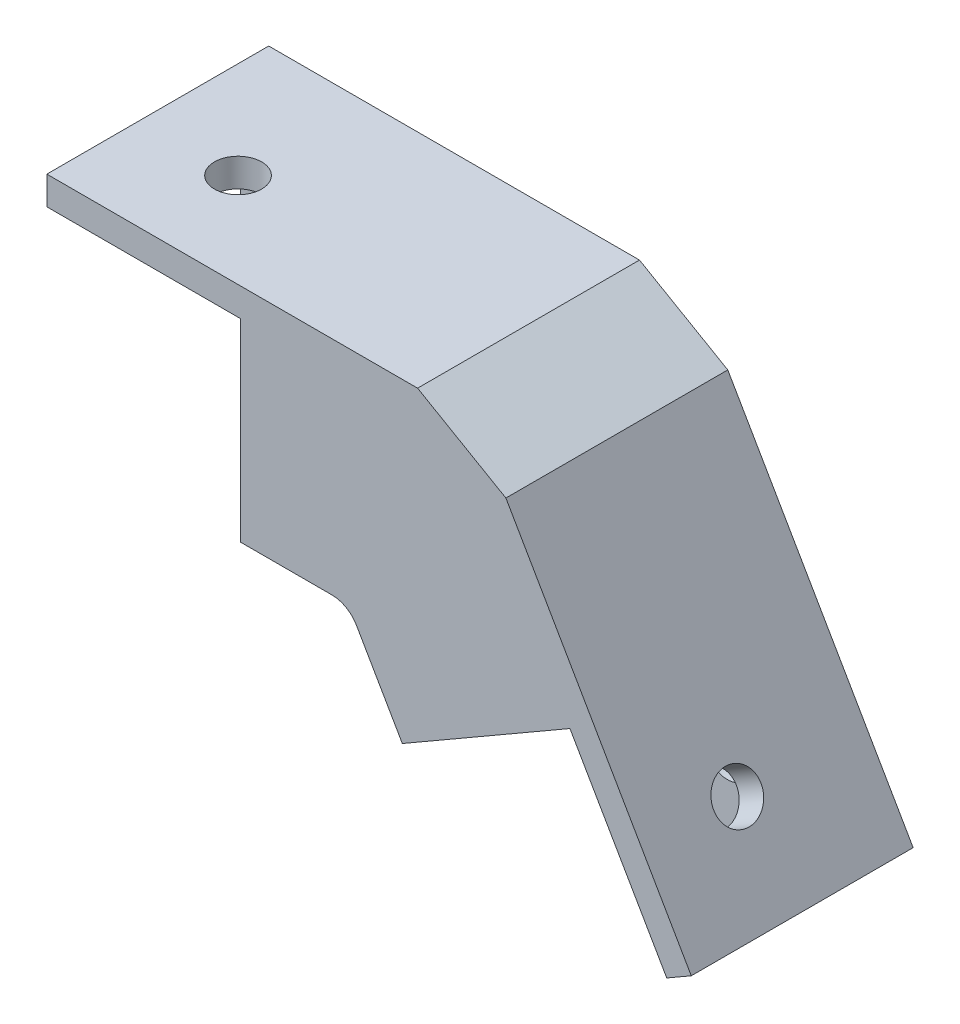
ISO-10303-21;
HEADER;
FILE_DESCRIPTION(('STEP AP214'),'2;1');
FILE_NAME('part.step','',(''),(''),'','','');
FILE_SCHEMA(('AUTOMOTIVE_DESIGN { 1 0 10303 214 1 1 1 1 }'));
ENDSEC;
DATA;
#1=APPLICATION_CONTEXT('core data for automotive mechanical design processes');
#2=APPLICATION_PROTOCOL_DEFINITION('international standard','automotive_design',2000,#1);
#3=PRODUCT_CONTEXT('',#1,'mechanical');
#4=PRODUCT('Part','Part','',(#3));
#5=PRODUCT_RELATED_PRODUCT_CATEGORY('part','',(#4));
#6=PRODUCT_DEFINITION_FORMATION('','',#4);
#7=PRODUCT_DEFINITION_CONTEXT('part definition',#1,'design');
#8=PRODUCT_DEFINITION('design','',#6,#7);
#9=PRODUCT_DEFINITION_SHAPE('','',#8);
#10=(LENGTH_UNIT() NAMED_UNIT(*) SI_UNIT(.MILLI.,.METRE.));
#11=(NAMED_UNIT(*) PLANE_ANGLE_UNIT() SI_UNIT($,.RADIAN.));
#12=(NAMED_UNIT(*) SI_UNIT($,.STERADIAN.) SOLID_ANGLE_UNIT());
#13=UNCERTAINTY_MEASURE_WITH_UNIT(LENGTH_MEASURE(1.E-05),#10,'distance_accuracy_value','');
#14=(GEOMETRIC_REPRESENTATION_CONTEXT(3) GLOBAL_UNCERTAINTY_ASSIGNED_CONTEXT((#13)) GLOBAL_UNIT_ASSIGNED_CONTEXT((#10,
#11,#12)) REPRESENTATION_CONTEXT('',''));
#15=CARTESIAN_POINT('',(0.,0.,0.));
#16=DIRECTION('',(0.,0.,1.));
#17=DIRECTION('',(1.,0.,0.));
#18=AXIS2_PLACEMENT_3D('',#15,#16,#17);
#19=CARTESIAN_POINT('',(37.5,1.84936490538901,23.5));
#20=DIRECTION('',(-0.499999999999998,0.86602540378444,0.));
#21=DIRECTION('',(-0.86602540378444,-0.499999999999998,0.));
#22=AXIS2_PLACEMENT_3D('',#19,#20,#21);
#23=PLANE('',#22);
#24=DIRECTION('',(-0.866025403784438,-0.5,0.));
#25=VECTOR('',#24,1.);
#26=CARTESIAN_POINT('',(17.1484030110656,-9.90063509461095,3.));
#27=LINE('',#26,#25);
#28=CARTESIAN_POINT('',(34.9019237886466,0.349364905389049,3.));
#29=VERTEX_POINT('',#28);
#30=CARTESIAN_POINT('',(17.1484030110656,-9.90063509461095,3.));
#31=VERTEX_POINT('',#30);
#32=EDGE_CURVE('E197',#29,#31,#27,.T.);
#33=ORIENTED_EDGE('',*,*,#32,.F.);
#34=DIRECTION('',(0.,0.,1.));
#35=VECTOR('',#34,1.);
#36=CARTESIAN_POINT('',(34.9019237886466,0.349364905389049,0.));
#37=LINE('',#36,#35);
#38=CARTESIAN_POINT('',(34.9019237886466,0.349364905389049,23.5));
#39=VERTEX_POINT('',#38);
#40=EDGE_CURVE('E261',#29,#39,#37,.T.);
#41=ORIENTED_EDGE('',*,*,#40,.T.);
#42=DIRECTION('',(0.86602540378444,0.499999999999998,0.));
#43=VECTOR('',#42,1.);
#44=CARTESIAN_POINT('',(37.5,1.84936490538901,23.5));
#45=LINE('',#44,#43);
#46=CARTESIAN_POINT('',(17.1484030110656,-9.90063509461095,23.5));
#47=VERTEX_POINT('',#46);
#48=EDGE_CURVE('E242',#47,#39,#45,.T.);
#49=ORIENTED_EDGE('',*,*,#48,.F.);
#50=DIRECTION('',(0.,0.,-1.));
#51=VECTOR('',#50,1.);
#52=CARTESIAN_POINT('',(17.1484030110656,-9.90063509461095,23.5));
#53=LINE('',#52,#51);
#54=EDGE_CURVE('E182',#47,#31,#53,.T.);
#55=ORIENTED_EDGE('',*,*,#54,.T.);
#56=EDGE_LOOP('',(#33,#41,#49,#55));
#57=FACE_BOUND('',#56,.T.);
#58=ADVANCED_FACE('F41',(#57),#23,.F.);
#59=CARTESIAN_POINT('',(0.,0.,23.5));
#60=DIRECTION('',(1.,0.,0.));
#61=DIRECTION('',(0.,0.,-1.));
#62=AXIS2_PLACEMENT_3D('',#59,#60,#61);
#63=PLANE('',#62);
#64=DIRECTION('',(0.,1.,0.));
#65=VECTOR('',#64,1.);
#66=CARTESIAN_POINT('',(0.,20.5,3.));
#67=LINE('',#66,#65);
#68=CARTESIAN_POINT('',(0.,0.,3.));
#69=VERTEX_POINT('',#68);
#70=CARTESIAN_POINT('',(0.,20.5,3.));
#71=VERTEX_POINT('',#70);
#72=EDGE_CURVE('E267',#69,#71,#67,.T.);
#73=ORIENTED_EDGE('',*,*,#72,.F.);
#74=DIRECTION('',(0.,0.,-1.));
#75=VECTOR('',#74,1.);
#76=CARTESIAN_POINT('',(0.,0.,23.5));
#77=LINE('',#76,#75);
#78=CARTESIAN_POINT('',(0.,0.,23.5));
#79=VERTEX_POINT('',#78);
#80=EDGE_CURVE('E178',#79,#69,#77,.T.);
#81=ORIENTED_EDGE('',*,*,#80,.F.);
#82=DIRECTION('',(0.,-1.,0.));
#83=VECTOR('',#82,1.);
#84=CARTESIAN_POINT('',(0.,0.,23.5));
#85=LINE('',#84,#83);
#86=CARTESIAN_POINT('',(0.,20.5,23.5));
#87=VERTEX_POINT('',#86);
#88=EDGE_CURVE('E183',#87,#79,#85,.T.);
#89=ORIENTED_EDGE('',*,*,#88,.F.);
#90=DIRECTION('',(0.,0.,1.));
#91=VECTOR('',#90,1.);
#92=CARTESIAN_POINT('',(0.,20.5,0.));
#93=LINE('',#92,#91);
#94=EDGE_CURVE('E194',#71,#87,#93,.T.);
#95=ORIENTED_EDGE('',*,*,#94,.F.);
#96=EDGE_LOOP('',(#73,#81,#89,#95));
#97=FACE_BOUND('',#96,.T.);
#98=ADVANCED_FACE('F314',(#97),#63,.F.);
#99=CARTESIAN_POINT('',(0.,20.5,0.));
#100=DIRECTION('',(0.,-1.,0.));
#101=DIRECTION('',(1.,0.,0.));
#102=AXIS2_PLACEMENT_3D('',#99,#100,#101);
#103=PLANE('',#102);
#104=CARTESIAN_POINT('',(-10.25,20.5,13.5));
#105=DIRECTION('',(0.,-1.,0.));
#106=DIRECTION('',(1.,0.,0.));
#107=AXIS2_PLACEMENT_3D('',#104,#105,#106);
#108=CIRCLE('',#107,2.5);
#109=CARTESIAN_POINT('',(-7.75,20.5,13.5));
#110=VERTEX_POINT('',#109);
#111=EDGE_CURVE('E366',#110,#110,#108,.T.);
#112=ORIENTED_EDGE('',*,*,#111,.F.);
#113=EDGE_LOOP('',(#112));
#114=FACE_BOUND('',#113,.T.);
#115=DIRECTION('',(0.,0.,1.));
#116=VECTOR('',#115,1.);
#117=CARTESIAN_POINT('',(-20.5,20.5,0.));
#118=LINE('',#117,#116);
#119=CARTESIAN_POINT('',(-20.5,20.5,3.));
#120=VERTEX_POINT('',#119);
#121=CARTESIAN_POINT('',(-20.5,20.5,23.5));
#122=VERTEX_POINT('',#121);
#123=EDGE_CURVE('E294',#120,#122,#118,.T.);
#124=ORIENTED_EDGE('',*,*,#123,.F.);
#125=DIRECTION('',(-1.,0.,0.));
#126=VECTOR('',#125,1.);
#127=CARTESIAN_POINT('',(0.,20.5,3.));
#128=LINE('',#127,#126);
#129=EDGE_CURVE('E270',#71,#120,#128,.T.);
#130=ORIENTED_EDGE('',*,*,#129,.F.);
#131=ORIENTED_EDGE('',*,*,#94,.T.);
#132=DIRECTION('',(1.,0.,0.));
#133=VECTOR('',#132,1.);
#134=CARTESIAN_POINT('',(0.,20.5,23.5));
#135=LINE('',#134,#133);
#136=EDGE_CURVE('E289',#122,#87,#135,.T.);
#137=ORIENTED_EDGE('',*,*,#136,.F.);
#138=EDGE_LOOP('',(#124,#130,#131,#137));
#139=FACE_BOUND('',#138,.T.);
#140=ADVANCED_FACE('F304',(#114,#139),#103,.T.);
#141=CARTESIAN_POINT('',(11.4322686740438,0.,23.5));
#142=DIRECTION('',(0.,1.,0.));
#143=DIRECTION('',(-1.,0.,0.));
#144=AXIS2_PLACEMENT_3D('',#141,#142,#143);
#145=PLANE('',#144);
#146=DIRECTION('',(1.,0.,0.));
#147=VECTOR('',#146,1.);
#148=CARTESIAN_POINT('',(11.4322686740438,0.,0.));
#149=LINE('',#148,#147);
#150=CARTESIAN_POINT('',(-20.5,0.,0.));
#151=VERTEX_POINT('',#150);
#152=CARTESIAN_POINT('',(9.70021786647487,0.,0.));
#153=VERTEX_POINT('',#152);
#154=EDGE_CURVE('E219',#151,#153,#149,.T.);
#155=ORIENTED_EDGE('',*,*,#154,.T.);
#156=DIRECTION('',(0.,0.,-1.));
#157=VECTOR('',#156,1.);
#158=CARTESIAN_POINT('',(9.70021786647487,0.,23.5));
#159=LINE('',#158,#157);
#160=CARTESIAN_POINT('',(9.70021786647487,0.,23.5));
#161=VERTEX_POINT('',#160);
#162=EDGE_CURVE('E66',#153,#161,#159,.F.);
#163=ORIENTED_EDGE('',*,*,#162,.T.);
#164=DIRECTION('',(1.,0.,0.));
#165=VECTOR('',#164,1.);
#166=CARTESIAN_POINT('',(11.4322686740438,0.,23.5));
#167=LINE('',#166,#165);
#168=EDGE_CURVE('E167',#79,#161,#167,.T.);
#169=ORIENTED_EDGE('',*,*,#168,.F.);
#170=ORIENTED_EDGE('',*,*,#80,.T.);
#171=DIRECTION('',(1.,0.,0.));
#172=VECTOR('',#171,1.);
#173=CARTESIAN_POINT('',(0.,0.,3.));
#174=LINE('',#173,#172);
#175=CARTESIAN_POINT('',(-20.5,0.,3.));
#176=VERTEX_POINT('',#175);
#177=EDGE_CURVE('E280',#176,#69,#174,.T.);
#178=ORIENTED_EDGE('',*,*,#177,.F.);
#179=DIRECTION('',(0.,0.,-1.));
#180=VECTOR('',#179,1.);
#181=CARTESIAN_POINT('',(-20.5,0.,3.));
#182=LINE('',#181,#180);
#183=EDGE_CURVE('E227',#176,#151,#182,.T.);
#184=ORIENTED_EDGE('',*,*,#183,.T.);
#185=EDGE_LOOP('',(#155,#163,#169,#170,#178,#184));
#186=FACE_BOUND('',#185,.T.);
#187=ADVANCED_FACE('F224',(#186),#145,.F.);
#188=CARTESIAN_POINT('',(17.1484030110656,-9.90063509461095,23.5));
#189=DIRECTION('',(0.86602540378444,0.499999999999998,0.));
#190=DIRECTION('',(-0.499999999999998,0.86602540378444,0.));
#191=AXIS2_PLACEMENT_3D('',#188,#189,#190);
#192=PLANE('',#191);
#193=DIRECTION('',(0.499999999999998,-0.866025403784439,0.));
#194=VECTOR('',#193,1.);
#195=CARTESIAN_POINT('',(17.1484030110656,-9.90063509461095,23.5));
#196=LINE('',#195,#194);
#197=CARTESIAN_POINT('',(12.2982940778282,-1.5,23.5));
#198=VERTEX_POINT('',#197);
#199=EDGE_CURVE('E172',#198,#47,#196,.T.);
#200=ORIENTED_EDGE('',*,*,#199,.F.);
#201=DIRECTION('',(0.,0.,-1.));
#202=VECTOR('',#201,1.);
#203=CARTESIAN_POINT('',(12.2982940778282,-1.5,0.));
#204=LINE('',#203,#202);
#205=CARTESIAN_POINT('',(12.2982940778282,-1.5,0.));
#206=VERTEX_POINT('',#205);
#207=EDGE_CURVE('E193',#198,#206,#204,.T.);
#208=ORIENTED_EDGE('',*,*,#207,.T.);
#209=DIRECTION('',(0.499999999999998,-0.866025403784439,0.));
#210=VECTOR('',#209,1.);
#211=CARTESIAN_POINT('',(17.1484030110656,-9.90063509461095,0.));
#212=LINE('',#211,#210);
#213=CARTESIAN_POINT('',(27.3984030110656,-27.6541558721919,0.));
#214=VERTEX_POINT('',#213);
#215=EDGE_CURVE('E174',#206,#214,#212,.T.);
#216=ORIENTED_EDGE('',*,*,#215,.T.);
#217=DIRECTION('',(0.,0.,-1.));
#218=VECTOR('',#217,1.);
#219=CARTESIAN_POINT('',(27.3984030110656,-27.6541558721919,3.));
#220=LINE('',#219,#218);
#221=CARTESIAN_POINT('',(27.3984030110656,-27.6541558721919,3.));
#222=VERTEX_POINT('',#221);
#223=EDGE_CURVE('E200',#222,#214,#220,.T.);
#224=ORIENTED_EDGE('',*,*,#223,.F.);
#225=DIRECTION('',(0.5,-0.866025403784439,0.));
#226=VECTOR('',#225,1.);
#227=CARTESIAN_POINT('',(17.1484030110656,-9.90063509461095,3.));
#228=LINE('',#227,#226);
#229=EDGE_CURVE('E204',#31,#222,#228,.T.);
#230=ORIENTED_EDGE('',*,*,#229,.F.);
#231=ORIENTED_EDGE('',*,*,#54,.F.);
#232=EDGE_LOOP('',(#200,#208,#216,#224,#230,#231));
#233=FACE_BOUND('',#232,.T.);
#234=ADVANCED_FACE('F238',(#233),#192,.F.);
#235=CARTESIAN_POINT('',(25.,23.5,23.5));
#236=DIRECTION('',(-0.86602540378444,-0.499999999999998,0.));
#237=DIRECTION('',(0.499999999999998,-0.86602540378444,0.));
#238=AXIS2_PLACEMENT_3D('',#235,#236,#237);
#239=PLANE('',#238);
#240=CARTESIAN_POINT('',(42.6249999999999,-7.02739548340146,13.5));
#241=DIRECTION('',(-0.86602540378444,-0.499999999999998,0.));
#242=DIRECTION('',(0.499999999999998,-0.86602540378444,0.));
#243=AXIS2_PLACEMENT_3D('',#240,#241,#242);
#244=CIRCLE('',#243,2.5);
#245=CARTESIAN_POINT('',(43.8749999999999,-9.19245899286256,13.5));
#246=VERTEX_POINT('',#245);
#247=EDGE_CURVE('E371',#246,#246,#244,.T.);
#248=ORIENTED_EDGE('',*,*,#247,.T.);
#249=EDGE_LOOP('',(#248));
#250=FACE_BOUND('',#249,.T.);
#251=DIRECTION('',(-0.499999999999998,0.86602540378444,0.));
#252=VECTOR('',#251,1.);
#253=CARTESIAN_POINT('',(25.,23.5,0.));
#254=LINE('',#253,#252);
#255=CARTESIAN_POINT('',(47.7499999999999,-15.9041558721919,0.));
#256=VERTEX_POINT('',#255);
#257=CARTESIAN_POINT('',(28.1173140978201,18.1006535994248,0.));
#258=VERTEX_POINT('',#257);
#259=EDGE_CURVE('E168',#256,#258,#254,.T.);
#260=ORIENTED_EDGE('',*,*,#259,.T.);
#261=DIRECTION('',(0.,0.,1.));
#262=VECTOR('',#261,1.);
#263=CARTESIAN_POINT('',(28.1173140978201,18.1006535994248,0.));
#264=LINE('',#263,#262);
#265=CARTESIAN_POINT('',(28.1173140978201,18.1006535994248,23.5));
#266=VERTEX_POINT('',#265);
#267=EDGE_CURVE('E58',#258,#266,#264,.T.);
#268=ORIENTED_EDGE('',*,*,#267,.T.);
#269=DIRECTION('',(-0.499999999999998,0.86602540378444,0.));
#270=VECTOR('',#269,1.);
#271=CARTESIAN_POINT('',(25.,23.5,23.5));
#272=LINE('',#271,#270);
#273=CARTESIAN_POINT('',(47.7499999999999,-15.9041558721919,23.5));
#274=VERTEX_POINT('',#273);
#275=EDGE_CURVE('E245',#274,#266,#272,.T.);
#276=ORIENTED_EDGE('',*,*,#275,.F.);
#277=DIRECTION('',(0.,0.,1.));
#278=VECTOR('',#277,1.);
#279=CARTESIAN_POINT('',(47.7499999999999,-15.9041558721919,0.));
#280=LINE('',#279,#278);
#281=EDGE_CURVE('E394',#256,#274,#280,.T.);
#282=ORIENTED_EDGE('',*,*,#281,.F.);
#283=EDGE_LOOP('',(#260,#268,#276,#282));
#284=FACE_BOUND('',#283,.T.);
#285=ADVANCED_FACE('F340',(#250,#284),#239,.F.);
#286=CARTESIAN_POINT('',(0.,23.5,23.5));
#287=DIRECTION('',(0.,-1.,0.));
#288=DIRECTION('',(0.,0.,-1.));
#289=AXIS2_PLACEMENT_3D('',#286,#287,#288);
#290=PLANE('',#289);
#291=CARTESIAN_POINT('',(-10.25,23.5,13.5));
#292=DIRECTION('',(0.,-1.,0.));
#293=DIRECTION('',(0.,0.,-1.));
#294=AXIS2_PLACEMENT_3D('',#291,#292,#293);
#295=CIRCLE('',#294,2.5);
#296=CARTESIAN_POINT('',(-10.25,23.5,11.));
#297=VERTEX_POINT('',#296);
#298=EDGE_CURVE('E45',#297,#297,#295,.T.);
#299=ORIENTED_EDGE('',*,*,#298,.T.);
#300=EDGE_LOOP('',(#299));
#301=FACE_BOUND('',#300,.T.);
#302=DIRECTION('',(-1.,0.,0.));
#303=VECTOR('',#302,1.);
#304=CARTESIAN_POINT('',(0.,23.5,23.5));
#305=LINE('',#304,#303);
#306=CARTESIAN_POINT('',(18.7653718043598,23.5,23.5));
#307=VERTEX_POINT('',#306);
#308=CARTESIAN_POINT('',(-20.5,23.5,23.5));
#309=VERTEX_POINT('',#308);
#310=EDGE_CURVE('E159',#307,#309,#305,.T.);
#311=ORIENTED_EDGE('',*,*,#310,.F.);
#312=DIRECTION('',(0.,0.,1.));
#313=VECTOR('',#312,1.);
#314=CARTESIAN_POINT('',(18.7653718043598,23.5,0.));
#315=LINE('',#314,#313);
#316=CARTESIAN_POINT('',(18.7653718043598,23.5,0.));
#317=VERTEX_POINT('',#316);
#318=EDGE_CURVE('E145',#317,#307,#315,.T.);
#319=ORIENTED_EDGE('',*,*,#318,.F.);
#320=DIRECTION('',(-1.,0.,0.));
#321=VECTOR('',#320,1.);
#322=CARTESIAN_POINT('',(0.,23.5,0.));
#323=LINE('',#322,#321);
#324=CARTESIAN_POINT('',(-20.5,23.5,0.));
#325=VERTEX_POINT('',#324);
#326=EDGE_CURVE('E157',#317,#325,#323,.T.);
#327=ORIENTED_EDGE('',*,*,#326,.T.);
#328=DIRECTION('',(0.,0.,1.));
#329=VECTOR('',#328,1.);
#330=CARTESIAN_POINT('',(-20.5,23.5,0.));
#331=LINE('',#330,#329);
#332=EDGE_CURVE('E288',#325,#309,#331,.T.);
#333=ORIENTED_EDGE('',*,*,#332,.T.);
#334=EDGE_LOOP('',(#311,#319,#327,#333));
#335=FACE_BOUND('',#334,.T.);
#336=ADVANCED_FACE('F155',(#301,#335),#290,.F.);
#337=CARTESIAN_POINT('',(0.,0.,23.5));
#338=DIRECTION('',(0.,0.,-1.));
#339=DIRECTION('',(-1.,0.,0.));
#340=AXIS2_PLACEMENT_3D('',#337,#338,#339);
#341=PLANE('',#340);
#342=ORIENTED_EDGE('',*,*,#275,.T.);
#343=DIRECTION('',(0.866025403784438,-0.500000000000001,0.));
#344=VECTOR('',#343,1.);
#345=CARTESIAN_POINT('',(18.7653718043598,23.5,23.5));
#346=LINE('',#345,#344);
#347=EDGE_CURVE('E151',#307,#266,#346,.T.);
#348=ORIENTED_EDGE('',*,*,#347,.F.);
#349=ORIENTED_EDGE('',*,*,#310,.T.);
#350=DIRECTION('',(0.,-1.,0.));
#351=VECTOR('',#350,1.);
#352=CARTESIAN_POINT('',(-20.5,20.5,23.5));
#353=LINE('',#352,#351);
#354=EDGE_CURVE('E285',#309,#122,#353,.T.);
#355=ORIENTED_EDGE('',*,*,#354,.T.);
#356=ORIENTED_EDGE('',*,*,#136,.T.);
#357=ORIENTED_EDGE('',*,*,#88,.T.);
#358=ORIENTED_EDGE('',*,*,#168,.T.);
#359=CARTESIAN_POINT('',(9.70021786647487,-3.,23.5));
#360=DIRECTION('',(0.,0.,-1.));
#361=DIRECTION('',(-1.,0.,0.));
#362=AXIS2_PLACEMENT_3D('',#359,#360,#361);
#363=CIRCLE('',#362,3.);
#364=EDGE_CURVE('E11',#161,#198,#363,.T.);
#365=ORIENTED_EDGE('',*,*,#364,.T.);
#366=ORIENTED_EDGE('',*,*,#199,.T.);
#367=ORIENTED_EDGE('',*,*,#48,.T.);
#368=DIRECTION('',(0.5,-0.866025403784439,0.));
#369=VECTOR('',#368,1.);
#370=CARTESIAN_POINT('',(34.9019237886466,0.349364905389049,23.5));
#371=LINE('',#370,#369);
#372=CARTESIAN_POINT('',(45.1519237886466,-17.4041558721919,23.5));
#373=VERTEX_POINT('',#372);
#374=EDGE_CURVE('E381',#39,#373,#371,.T.);
#375=ORIENTED_EDGE('',*,*,#374,.T.);
#376=DIRECTION('',(0.866025403784438,0.500000000000001,0.));
#377=VECTOR('',#376,1.);
#378=CARTESIAN_POINT('',(45.1519237886466,-17.4041558721919,23.5));
#379=LINE('',#378,#377);
#380=EDGE_CURVE('E386',#373,#274,#379,.T.);
#381=ORIENTED_EDGE('',*,*,#380,.T.);
#382=EDGE_LOOP('',(#342,#348,#349,#355,#356,#357,#358,#365,#366,#367,#375,#381));
#383=FACE_BOUND('',#382,.T.);
#384=ADVANCED_FACE('F234',(#383),#341,.F.);
#385=CARTESIAN_POINT('',(0.,0.,0.));
#386=DIRECTION('',(0.,0.,-1.));
#387=DIRECTION('',(-1.,0.,0.));
#388=AXIS2_PLACEMENT_3D('',#385,#386,#387);
#389=PLANE('',#388);
#390=CARTESIAN_POINT('',(31.05865704891,-13.9939018343476,0.));
#391=DIRECTION('',(0.,0.,1.));
#392=DIRECTION('',(1.,0.,0.));
#393=AXIS2_PLACEMENT_3D('',#390,#391,#392);
#394=CIRCLE('',#393,2.5);
#395=CARTESIAN_POINT('',(33.55865704891,-13.9939018343476,0.));
#396=VERTEX_POINT('',#395);
#397=EDGE_CURVE('E439',#396,#396,#394,.T.);
#398=ORIENTED_EDGE('',*,*,#397,.T.);
#399=EDGE_LOOP('',(#398));
#400=FACE_BOUND('',#399,.T.);
#401=CARTESIAN_POINT('',(-10.5,10.,0.));
#402=DIRECTION('',(0.,0.,1.));
#403=DIRECTION('',(1.,0.,0.));
#404=AXIS2_PLACEMENT_3D('',#401,#402,#403);
#405=CIRCLE('',#404,2.5);
#406=CARTESIAN_POINT('',(-8.,10.,0.));
#407=VERTEX_POINT('',#406);
#408=EDGE_CURVE('E449',#407,#407,#405,.T.);
#409=ORIENTED_EDGE('',*,*,#408,.T.);
#410=EDGE_LOOP('',(#409));
#411=FACE_BOUND('',#410,.T.);
#412=DIRECTION('',(0.866025403784438,-0.500000000000001,0.));
#413=VECTOR('',#412,1.);
#414=CARTESIAN_POINT('',(18.7653718043598,23.5,0.));
#415=LINE('',#414,#413);
#416=EDGE_CURVE('E142',#317,#258,#415,.T.);
#417=ORIENTED_EDGE('',*,*,#416,.T.);
#418=ORIENTED_EDGE('',*,*,#259,.F.);
#419=DIRECTION('',(0.866025403784438,0.5,0.));
#420=VECTOR('',#419,1.);
#421=CARTESIAN_POINT('',(27.3984030110656,-27.6541558721919,0.));
#422=LINE('',#421,#420);
#423=EDGE_CURVE('E209',#214,#256,#422,.T.);
#424=ORIENTED_EDGE('',*,*,#423,.F.);
#425=ORIENTED_EDGE('',*,*,#215,.F.);
#426=CARTESIAN_POINT('',(9.70021786647487,-3.,0.));
#427=DIRECTION('',(0.,0.,-1.));
#428=DIRECTION('',(-1.,0.,0.));
#429=AXIS2_PLACEMENT_3D('',#426,#427,#428);
#430=CIRCLE('',#429,3.);
#431=EDGE_CURVE('E51',#206,#153,#430,.F.);
#432=ORIENTED_EDGE('',*,*,#431,.T.);
#433=ORIENTED_EDGE('',*,*,#154,.F.);
#434=DIRECTION('',(0.,-1.,0.));
#435=VECTOR('',#434,1.);
#436=CARTESIAN_POINT('',(-20.5,20.5,0.));
#437=LINE('',#436,#435);
#438=EDGE_CURVE('E165',#325,#151,#437,.T.);
#439=ORIENTED_EDGE('',*,*,#438,.F.);
#440=ORIENTED_EDGE('',*,*,#326,.F.);
#441=EDGE_LOOP('',(#417,#418,#424,#425,#432,#433,#439,#440));
#442=FACE_BOUND('',#441,.T.);
#443=ADVANCED_FACE('F163',(#400,#411,#442),#389,.T.);
#444=CARTESIAN_POINT('',(-20.5,20.5,0.));
#445=DIRECTION('',(-1.,0.,0.));
#446=DIRECTION('',(0.,0.,1.));
#447=AXIS2_PLACEMENT_3D('',#444,#445,#446);
#448=PLANE('',#447);
#449=ORIENTED_EDGE('',*,*,#354,.F.);
#450=ORIENTED_EDGE('',*,*,#332,.F.);
#451=ORIENTED_EDGE('',*,*,#438,.T.);
#452=ORIENTED_EDGE('',*,*,#183,.F.);
#453=DIRECTION('',(0.,-1.,0.));
#454=VECTOR('',#453,1.);
#455=CARTESIAN_POINT('',(-20.5,20.5,3.));
#456=LINE('',#455,#454);
#457=EDGE_CURVE('E277',#120,#176,#456,.T.);
#458=ORIENTED_EDGE('',*,*,#457,.F.);
#459=ORIENTED_EDGE('',*,*,#123,.T.);
#460=EDGE_LOOP('',(#449,#450,#451,#452,#458,#459));
#461=FACE_BOUND('',#460,.T.);
#462=ADVANCED_FACE('F299',(#461),#448,.T.);
#463=CARTESIAN_POINT('',(0.,0.,3.));
#464=DIRECTION('',(0.,0.,-1.));
#465=DIRECTION('',(-1.,0.,0.));
#466=AXIS2_PLACEMENT_3D('',#463,#464,#465);
#467=PLANE('',#466);
#468=CARTESIAN_POINT('',(-10.5,10.,3.));
#469=DIRECTION('',(0.,0.,1.));
#470=DIRECTION('',(1.,0.,0.));
#471=AXIS2_PLACEMENT_3D('',#468,#469,#470);
#472=CIRCLE('',#471,2.5);
#473=CARTESIAN_POINT('',(-8.,10.,3.));
#474=VERTEX_POINT('',#473);
#475=EDGE_CURVE('E446',#474,#474,#472,.T.);
#476=ORIENTED_EDGE('',*,*,#475,.F.);
#477=EDGE_LOOP('',(#476));
#478=FACE_BOUND('',#477,.T.);
#479=ORIENTED_EDGE('',*,*,#72,.T.);
#480=ORIENTED_EDGE('',*,*,#129,.T.);
#481=ORIENTED_EDGE('',*,*,#457,.T.);
#482=ORIENTED_EDGE('',*,*,#177,.T.);
#483=EDGE_LOOP('',(#479,#480,#481,#482));
#484=FACE_BOUND('',#483,.T.);
#485=ADVANCED_FACE('F317',(#478,#484),#467,.F.);
#486=CARTESIAN_POINT('',(27.3984030110656,-27.6541558721919,3.));
#487=DIRECTION('',(-0.5,0.866025403784439,0.));
#488=DIRECTION('',(-0.866025403784439,-0.5,0.));
#489=AXIS2_PLACEMENT_3D('',#486,#487,#488);
#490=PLANE('',#489);
#491=ORIENTED_EDGE('',*,*,#423,.T.);
#492=ORIENTED_EDGE('',*,*,#281,.T.);
#493=ORIENTED_EDGE('',*,*,#380,.F.);
#494=DIRECTION('',(0.,0.,1.));
#495=VECTOR('',#494,1.);
#496=CARTESIAN_POINT('',(45.1519237886466,-17.4041558721919,0.));
#497=LINE('',#496,#495);
#498=CARTESIAN_POINT('',(45.1519237886466,-17.4041558721919,3.));
#499=VERTEX_POINT('',#498);
#500=EDGE_CURVE('E390',#499,#373,#497,.T.);
#501=ORIENTED_EDGE('',*,*,#500,.F.);
#502=DIRECTION('',(0.866025403784438,0.5,0.));
#503=VECTOR('',#502,1.);
#504=CARTESIAN_POINT('',(27.3984030110656,-27.6541558721919,3.));
#505=LINE('',#504,#503);
#506=EDGE_CURVE('E208',#222,#499,#505,.T.);
#507=ORIENTED_EDGE('',*,*,#506,.F.);
#508=ORIENTED_EDGE('',*,*,#223,.T.);
#509=EDGE_LOOP('',(#491,#492,#493,#501,#507,#508));
#510=FACE_BOUND('',#509,.T.);
#511=ADVANCED_FACE('F263',(#510),#490,.F.);
#512=CARTESIAN_POINT('',(0.,0.,3.));
#513=DIRECTION('',(0.,0.,1.));
#514=DIRECTION('',(1.,0.,0.));
#515=AXIS2_PLACEMENT_3D('',#512,#513,#514);
#516=PLANE('',#515);
#517=CARTESIAN_POINT('',(31.05865704891,-13.9939018343476,3.));
#518=DIRECTION('',(0.,0.,1.));
#519=DIRECTION('',(1.,0.,0.));
#520=AXIS2_PLACEMENT_3D('',#517,#518,#519);
#521=CIRCLE('',#520,2.5);
#522=CARTESIAN_POINT('',(33.55865704891,-13.9939018343476,3.));
#523=VERTEX_POINT('',#522);
#524=EDGE_CURVE('E442',#523,#523,#521,.T.);
#525=ORIENTED_EDGE('',*,*,#524,.F.);
#526=EDGE_LOOP('',(#525));
#527=FACE_BOUND('',#526,.T.);
#528=ORIENTED_EDGE('',*,*,#229,.T.);
#529=ORIENTED_EDGE('',*,*,#506,.T.);
#530=DIRECTION('',(-0.5,0.866025403784439,0.));
#531=VECTOR('',#530,1.);
#532=CARTESIAN_POINT('',(34.9019237886466,0.349364905389049,3.));
#533=LINE('',#532,#531);
#534=EDGE_CURVE('E201',#499,#29,#533,.T.);
#535=ORIENTED_EDGE('',*,*,#534,.T.);
#536=ORIENTED_EDGE('',*,*,#32,.T.);
#537=EDGE_LOOP('',(#528,#529,#535,#536));
#538=FACE_BOUND('',#537,.T.);
#539=ADVANCED_FACE('F325',(#527,#538),#516,.T.);
#540=CARTESIAN_POINT('',(34.9019237886466,0.349364905389049,0.));
#541=DIRECTION('',(-0.866025403784438,-0.5,0.));
#542=DIRECTION('',(0.5,-0.866025403784439,0.));
#543=AXIS2_PLACEMENT_3D('',#540,#541,#542);
#544=PLANE('',#543);
#545=CARTESIAN_POINT('',(40.0269237886466,-8.52739548340144,13.5));
#546=DIRECTION('',(-0.866025403784438,-0.5,0.));
#547=DIRECTION('',(0.5,-0.866025403784438,0.));
#548=AXIS2_PLACEMENT_3D('',#545,#546,#547);
#549=CIRCLE('',#548,2.5);
#550=CARTESIAN_POINT('',(41.2769237886466,-10.6924589928625,13.5));
#551=VERTEX_POINT('',#550);
#552=EDGE_CURVE('E376',#551,#551,#549,.T.);
#553=ORIENTED_EDGE('',*,*,#552,.F.);
#554=EDGE_LOOP('',(#553));
#555=FACE_BOUND('',#554,.T.);
#556=ORIENTED_EDGE('',*,*,#40,.F.);
#557=ORIENTED_EDGE('',*,*,#534,.F.);
#558=ORIENTED_EDGE('',*,*,#500,.T.);
#559=ORIENTED_EDGE('',*,*,#374,.F.);
#560=EDGE_LOOP('',(#556,#557,#558,#559));
#561=FACE_BOUND('',#560,.T.);
#562=ADVANCED_FACE('F405',(#555,#561),#544,.T.);
#563=CARTESIAN_POINT('',(9.70021786647487,-3.,23.5));
#564=DIRECTION('',(0.,0.,1.));
#565=DIRECTION('',(1.,0.,0.));
#566=AXIS2_PLACEMENT_3D('',#563,#564,#565);
#567=CYLINDRICAL_SURFACE('',#566,3.);
#568=ORIENTED_EDGE('',*,*,#364,.F.);
#569=ORIENTED_EDGE('',*,*,#162,.F.);
#570=ORIENTED_EDGE('',*,*,#431,.F.);
#571=ORIENTED_EDGE('',*,*,#207,.F.);
#572=EDGE_LOOP('',(#568,#569,#570,#571));
#573=FACE_BOUND('',#572,.T.);
#574=ADVANCED_FACE('F43',(#573),#567,.F.);
#575=CARTESIAN_POINT('',(18.7653718043598,23.5,0.));
#576=DIRECTION('',(-0.500000000000001,-0.866025403784438,0.));
#577=DIRECTION('',(0.866025403784438,-0.500000000000001,0.));
#578=AXIS2_PLACEMENT_3D('',#575,#576,#577);
#579=PLANE('',#578);
#580=ORIENTED_EDGE('',*,*,#347,.T.);
#581=ORIENTED_EDGE('',*,*,#267,.F.);
#582=ORIENTED_EDGE('',*,*,#416,.F.);
#583=ORIENTED_EDGE('',*,*,#318,.T.);
#584=EDGE_LOOP('',(#580,#581,#582,#583));
#585=FACE_BOUND('',#584,.T.);
#586=ADVANCED_FACE('F144',(#585),#579,.F.);
#587=CARTESIAN_POINT('',(-10.25,60.5,13.5));
#588=DIRECTION('',(0.,-1.,0.));
#589=DIRECTION('',(1.,0.,0.));
#590=AXIS2_PLACEMENT_3D('',#587,#588,#589);
#591=CYLINDRICAL_SURFACE('',#590,2.5);
#592=ORIENTED_EDGE('',*,*,#111,.T.);
#593=EDGE_LOOP('',(#592));
#594=FACE_BOUND('',#593,.T.);
#595=ORIENTED_EDGE('',*,*,#298,.F.);
#596=EDGE_LOOP('',(#595));
#597=FACE_BOUND('',#596,.T.);
#598=ADVANCED_FACE('F420',(#594,#597),#591,.F.);
#599=CARTESIAN_POINT('',(59.6874999999999,2.82364348464655,13.5));
#600=DIRECTION('',(-0.866025403784438,-0.5,0.));
#601=DIRECTION('',(0.5,-0.866025403784439,0.));
#602=AXIS2_PLACEMENT_3D('',#599,#600,#601);
#603=CYLINDRICAL_SURFACE('',#602,2.5);
#604=ORIENTED_EDGE('',*,*,#552,.T.);
#605=EDGE_LOOP('',(#604));
#606=FACE_BOUND('',#605,.T.);
#607=ORIENTED_EDGE('',*,*,#247,.F.);
#608=EDGE_LOOP('',(#607));
#609=FACE_BOUND('',#608,.T.);
#610=ADVANCED_FACE('F423',(#606,#609),#603,.F.);
#611=CARTESIAN_POINT('',(-10.5,10.,0.));
#612=DIRECTION('',(0.,0.,1.));
#613=DIRECTION('',(1.,0.,0.));
#614=AXIS2_PLACEMENT_3D('',#611,#612,#613);
#615=CYLINDRICAL_SURFACE('',#614,2.5);
#616=ORIENTED_EDGE('',*,*,#408,.F.);
#617=EDGE_LOOP('',(#616));
#618=FACE_BOUND('',#617,.T.);
#619=ORIENTED_EDGE('',*,*,#475,.T.);
#620=EDGE_LOOP('',(#619));
#621=FACE_BOUND('',#620,.T.);
#622=ADVANCED_FACE('F426',(#618,#621),#615,.F.);
#623=CARTESIAN_POINT('',(31.05865704891,-13.9939018343476,0.));
#624=DIRECTION('',(0.,0.,1.));
#625=DIRECTION('',(1.,0.,0.));
#626=AXIS2_PLACEMENT_3D('',#623,#624,#625);
#627=CYLINDRICAL_SURFACE('',#626,2.5);
#628=ORIENTED_EDGE('',*,*,#397,.F.);
#629=EDGE_LOOP('',(#628));
#630=FACE_BOUND('',#629,.T.);
#631=ORIENTED_EDGE('',*,*,#524,.T.);
#632=EDGE_LOOP('',(#631));
#633=FACE_BOUND('',#632,.T.);
#634=ADVANCED_FACE('F430',(#630,#633),#627,.F.);
#635=CLOSED_SHELL('',(#58,#98,#140,#187,#234,#285,#336,#384,#443,#462,#485,#511,#539,#562,#574,
#586,#598,#610,#622,#634));
#636=MANIFOLD_SOLID_BREP('B2',#635);
#637=ADVANCED_BREP_SHAPE_REPRESENTATION('',(#18,#636),#14);
#638=SHAPE_DEFINITION_REPRESENTATION(#9,#637);
ENDSEC;
END-ISO-10303-21;
